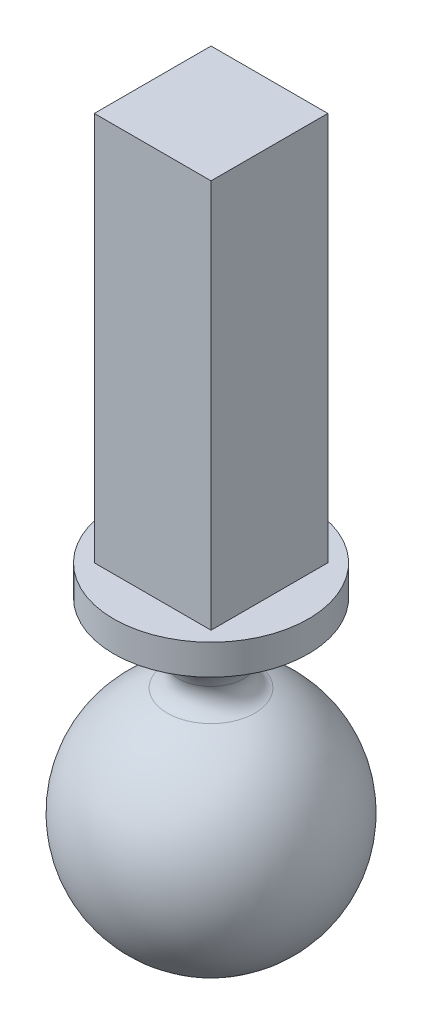
ISO-10303-21;
HEADER;
FILE_DESCRIPTION(('STEP AP214'),'2;1');
FILE_NAME('part.step','',(''),(''),'','','');
FILE_SCHEMA(('AUTOMOTIVE_DESIGN { 1 0 10303 214 1 1 1 1 }'));
ENDSEC;
DATA;
#1=APPLICATION_CONTEXT('core data for automotive mechanical design processes');
#2=APPLICATION_PROTOCOL_DEFINITION('international standard','automotive_design',2000,#1);
#3=PRODUCT_CONTEXT('',#1,'mechanical');
#4=PRODUCT('Part','Part','',(#3));
#5=PRODUCT_RELATED_PRODUCT_CATEGORY('part','',(#4));
#6=PRODUCT_DEFINITION_FORMATION('','',#4);
#7=PRODUCT_DEFINITION_CONTEXT('part definition',#1,'design');
#8=PRODUCT_DEFINITION('design','',#6,#7);
#9=PRODUCT_DEFINITION_SHAPE('','',#8);
#10=(LENGTH_UNIT() NAMED_UNIT(*) SI_UNIT(.MILLI.,.METRE.));
#11=(NAMED_UNIT(*) PLANE_ANGLE_UNIT() SI_UNIT($,.RADIAN.));
#12=(NAMED_UNIT(*) SI_UNIT($,.STERADIAN.) SOLID_ANGLE_UNIT());
#13=UNCERTAINTY_MEASURE_WITH_UNIT(LENGTH_MEASURE(1.E-05),#10,'distance_accuracy_value','');
#14=(GEOMETRIC_REPRESENTATION_CONTEXT(3) GLOBAL_UNCERTAINTY_ASSIGNED_CONTEXT((#13)) GLOBAL_UNIT_ASSIGNED_CONTEXT((#10,
#11,#12)) REPRESENTATION_CONTEXT('',''));
#15=CARTESIAN_POINT('',(0.,0.,0.));
#16=DIRECTION('',(0.,0.,1.));
#17=DIRECTION('',(1.,0.,0.));
#18=AXIS2_PLACEMENT_3D('',#15,#16,#17);
#19=CARTESIAN_POINT('',(-3.69404705938733,11.1288388993847,0.));
#20=DIRECTION('',(0.,1.,0.));
#21=DIRECTION('',(0.,0.,1.));
#22=AXIS2_PLACEMENT_3D('',#19,#20,#21);
#23=PLANE('',#22);
#24=CARTESIAN_POINT('',(0.,11.1288388993847,0.));
#25=DIRECTION('',(0.,1.,0.));
#26=DIRECTION('',(0.,0.,1.));
#27=AXIS2_PLACEMENT_3D('',#24,#25,#26);
#28=CIRCLE('',#27,5.);
#29=CARTESIAN_POINT('',(0.,11.1288388993847,5.));
#30=VERTEX_POINT('',#29);
#31=EDGE_CURVE('E112',#30,#30,#28,.T.);
#32=ORIENTED_EDGE('',*,*,#31,.T.);
#33=EDGE_LOOP('',(#32));
#34=FACE_BOUND('',#33,.T.);
#35=DIRECTION('',(-1.,0.,0.));
#36=VECTOR('',#35,1.);
#37=CARTESIAN_POINT('',(-3.,11.1288388993847,-3.));
#38=LINE('',#37,#36);
#39=CARTESIAN_POINT('',(3.,11.1288388993847,-3.));
#40=VERTEX_POINT('',#39);
#41=CARTESIAN_POINT('',(-3.,11.1288388993847,-3.));
#42=VERTEX_POINT('',#41);
#43=EDGE_CURVE('E91',#40,#42,#38,.T.);
#44=ORIENTED_EDGE('',*,*,#43,.F.);
#45=DIRECTION('',(0.,0.,-1.));
#46=VECTOR('',#45,1.);
#47=CARTESIAN_POINT('',(3.,11.1288388993847,-3.));
#48=LINE('',#47,#46);
#49=CARTESIAN_POINT('',(3.,11.1288388993847,3.));
#50=VERTEX_POINT('',#49);
#51=EDGE_CURVE('E102',#50,#40,#48,.T.);
#52=ORIENTED_EDGE('',*,*,#51,.F.);
#53=DIRECTION('',(1.,0.,0.));
#54=VECTOR('',#53,1.);
#55=CARTESIAN_POINT('',(-3.,11.1288388993847,3.));
#56=LINE('',#55,#54);
#57=CARTESIAN_POINT('',(-3.,11.1288388993847,3.));
#58=VERTEX_POINT('',#57);
#59=EDGE_CURVE('E72',#58,#50,#56,.T.);
#60=ORIENTED_EDGE('',*,*,#59,.F.);
#61=DIRECTION('',(0.,0.,1.));
#62=VECTOR('',#61,1.);
#63=CARTESIAN_POINT('',(-3.,11.1288388993847,-3.));
#64=LINE('',#63,#62);
#65=EDGE_CURVE('E106',#42,#58,#64,.T.);
#66=ORIENTED_EDGE('',*,*,#65,.F.);
#67=EDGE_LOOP('',(#44,#52,#60,#66));
#68=FACE_BOUND('',#67,.T.);
#69=ADVANCED_FACE('F35',(#34,#68),#23,.T.);
#70=CARTESIAN_POINT('',(0.,0.,0.));
#71=DIRECTION('',(0.,1.,0.));
#72=DIRECTION('',(-1.,0.,0.));
#73=AXIS2_PLACEMENT_3D('',#70,#71,#72);
#74=SPHERICAL_SURFACE('',#73,6.);
#75=CARTESIAN_POINT('',(0.,5.56216801963144,0.));
#76=DIRECTION('',(0.,1.,0.));
#77=DIRECTION('',(0.,0.,1.));
#78=AXIS2_PLACEMENT_3D('',#75,#76,#77);
#79=CIRCLE('',#78,2.24995264869936);
#80=CARTESIAN_POINT('',(0.,5.56216801963144,2.24995264869936));
#81=VERTEX_POINT('',#80);
#82=EDGE_CURVE('E11',#81,#81,#79,.T.);
#83=ORIENTED_EDGE('',*,*,#82,.F.);
#84=EDGE_LOOP('',(#83));
#85=FACE_BOUND('',#84,.T.);
#86=ADVANCED_FACE('F37',(#85),#74,.T.);
#87=CARTESIAN_POINT('',(0.,6.48919602290335,0.));
#88=DIRECTION('',(0.,1.,0.));
#89=DIRECTION('',(0.,0.,1.));
#90=AXIS2_PLACEMENT_3D('',#87,#88,#89);
#91=TOROIDAL_SURFACE('',#90,2.62494475681592,1.);
#92=ORIENTED_EDGE('',*,*,#82,.T.);
#93=EDGE_LOOP('',(#92));
#94=FACE_BOUND('',#93,.T.);
#95=CARTESIAN_POINT('',(0.,6.81383167794624,0.));
#96=DIRECTION('',(0.,1.,0.));
#97=DIRECTION('',(0.,0.,1.));
#98=AXIS2_PLACEMENT_3D('',#95,#96,#97);
#99=CIRCLE('',#98,1.67910561009229);
#100=CARTESIAN_POINT('',(0.,6.81383167794624,1.67910561009229));
#101=VERTEX_POINT('',#100);
#102=EDGE_CURVE('E43',#101,#101,#99,.T.);
#103=ORIENTED_EDGE('',*,*,#102,.F.);
#104=EDGE_LOOP('',(#103));
#105=FACE_BOUND('',#104,.T.);
#106=ADVANCED_FACE('F126',(#94,#105),#91,.F.);
#107=CARTESIAN_POINT('',(-5.,9.57280986376108,0.));
#108=CARTESIAN_POINT('',(-2.25540699268525,8.49290912831238,0.));
#109=CARTESIAN_POINT('',(-1.67910561009229,6.81383167794624,0.));
#110=B_SPLINE_CURVE_WITH_KNOTS('',2,(#107,#108,#109),.UNSPECIFIED.,.F.,.F.,(3,3),(0.,1.),.UNSPECIFIED.);
#111=CARTESIAN_POINT('',(0.,11.8823529411765,0.));
#112=DIRECTION('',(0.,1.,0.));
#113=AXIS1_PLACEMENT('',#111,#112);
#114=SURFACE_OF_REVOLUTION('',#110,#113);
#115=ORIENTED_EDGE('',*,*,#102,.T.);
#116=EDGE_LOOP('',(#115));
#117=FACE_BOUND('',#116,.T.);
#118=CARTESIAN_POINT('',(0.,9.57280986376108,0.));
#119=DIRECTION('',(0.,1.,0.));
#120=DIRECTION('',(0.,0.,1.));
#121=AXIS2_PLACEMENT_3D('',#118,#119,#120);
#122=CIRCLE('',#121,5.);
#123=CARTESIAN_POINT('',(0.,9.57280986376108,5.));
#124=VERTEX_POINT('',#123);
#125=EDGE_CURVE('E219',#124,#124,#122,.T.);
#126=ORIENTED_EDGE('',*,*,#125,.F.);
#127=EDGE_LOOP('',(#126));
#128=FACE_BOUND('',#127,.T.);
#129=ADVANCED_FACE('F122',(#117,#128),#114,.F.);
#130=CARTESIAN_POINT('',(0.,11.8823529411765,0.));
#131=DIRECTION('',(0.,1.,0.));
#132=DIRECTION('',(0.,0.,1.));
#133=AXIS2_PLACEMENT_3D('',#130,#131,#132);
#134=CYLINDRICAL_SURFACE('',#133,5.);
#135=ORIENTED_EDGE('',*,*,#125,.T.);
#136=EDGE_LOOP('',(#135));
#137=FACE_BOUND('',#136,.T.);
#138=ORIENTED_EDGE('',*,*,#31,.F.);
#139=EDGE_LOOP('',(#138));
#140=FACE_BOUND('',#139,.T.);
#141=ADVANCED_FACE('F125',(#137,#140),#134,.T.);
#142=CARTESIAN_POINT('',(3.,31.1288388993847,-3.));
#143=DIRECTION('',(-1.,0.,0.));
#144=DIRECTION('',(0.,0.,1.));
#145=AXIS2_PLACEMENT_3D('',#142,#143,#144);
#146=PLANE('',#145);
#147=ORIENTED_EDGE('',*,*,#51,.T.);
#148=DIRECTION('',(0.,-1.,0.));
#149=VECTOR('',#148,1.);
#150=CARTESIAN_POINT('',(3.,31.1288388993847,-3.));
#151=LINE('',#150,#149);
#152=CARTESIAN_POINT('',(3.,31.1288388993847,-3.));
#153=VERTEX_POINT('',#152);
#154=EDGE_CURVE('E94',#153,#40,#151,.T.);
#155=ORIENTED_EDGE('',*,*,#154,.F.);
#156=DIRECTION('',(0.,0.,-1.));
#157=VECTOR('',#156,1.);
#158=CARTESIAN_POINT('',(3.,31.1288388993847,-3.));
#159=LINE('',#158,#157);
#160=CARTESIAN_POINT('',(3.,31.1288388993847,3.));
#161=VERTEX_POINT('',#160);
#162=EDGE_CURVE('E84',#161,#153,#159,.T.);
#163=ORIENTED_EDGE('',*,*,#162,.F.);
#164=DIRECTION('',(0.,-1.,0.));
#165=VECTOR('',#164,1.);
#166=CARTESIAN_POINT('',(3.,31.1288388993847,3.));
#167=LINE('',#166,#165);
#168=EDGE_CURVE('E98',#161,#50,#167,.T.);
#169=ORIENTED_EDGE('',*,*,#168,.T.);
#170=EDGE_LOOP('',(#147,#155,#163,#169));
#171=FACE_BOUND('',#170,.T.);
#172=ADVANCED_FACE('F143',(#171),#146,.F.);
#173=CARTESIAN_POINT('',(-3.,31.1288388993847,-3.));
#174=DIRECTION('',(0.,0.,1.));
#175=DIRECTION('',(1.,0.,0.));
#176=AXIS2_PLACEMENT_3D('',#173,#174,#175);
#177=PLANE('',#176);
#178=ORIENTED_EDGE('',*,*,#43,.T.);
#179=DIRECTION('',(0.,-1.,0.));
#180=VECTOR('',#179,1.);
#181=CARTESIAN_POINT('',(-3.,31.1288388993847,-3.));
#182=LINE('',#181,#180);
#183=CARTESIAN_POINT('',(-3.,31.1288388993847,-3.));
#184=VERTEX_POINT('',#183);
#185=EDGE_CURVE('E88',#184,#42,#182,.T.);
#186=ORIENTED_EDGE('',*,*,#185,.F.);
#187=DIRECTION('',(-1.,0.,0.));
#188=VECTOR('',#187,1.);
#189=CARTESIAN_POINT('',(-3.,31.1288388993847,-3.));
#190=LINE('',#189,#188);
#191=EDGE_CURVE('E79',#153,#184,#190,.T.);
#192=ORIENTED_EDGE('',*,*,#191,.F.);
#193=ORIENTED_EDGE('',*,*,#154,.T.);
#194=EDGE_LOOP('',(#178,#186,#192,#193));
#195=FACE_BOUND('',#194,.T.);
#196=ADVANCED_FACE('F89',(#195),#177,.F.);
#197=CARTESIAN_POINT('',(-3.,31.1288388993847,-3.));
#198=DIRECTION('',(1.,0.,0.));
#199=DIRECTION('',(0.,0.,-1.));
#200=AXIS2_PLACEMENT_3D('',#197,#198,#199);
#201=PLANE('',#200);
#202=ORIENTED_EDGE('',*,*,#65,.T.);
#203=DIRECTION('',(0.,-1.,0.));
#204=VECTOR('',#203,1.);
#205=CARTESIAN_POINT('',(-3.,31.1288388993847,3.));
#206=LINE('',#205,#204);
#207=CARTESIAN_POINT('',(-3.,31.1288388993847,3.));
#208=VERTEX_POINT('',#207);
#209=EDGE_CURVE('E50',#208,#58,#206,.T.);
#210=ORIENTED_EDGE('',*,*,#209,.F.);
#211=DIRECTION('',(0.,0.,1.));
#212=VECTOR('',#211,1.);
#213=CARTESIAN_POINT('',(-3.,31.1288388993847,-3.));
#214=LINE('',#213,#212);
#215=EDGE_CURVE('E82',#184,#208,#214,.T.);
#216=ORIENTED_EDGE('',*,*,#215,.F.);
#217=ORIENTED_EDGE('',*,*,#185,.T.);
#218=EDGE_LOOP('',(#202,#210,#216,#217));
#219=FACE_BOUND('',#218,.T.);
#220=ADVANCED_FACE('F96',(#219),#201,.F.);
#221=CARTESIAN_POINT('',(-3.,31.1288388993847,3.));
#222=DIRECTION('',(0.,0.,-1.));
#223=DIRECTION('',(-1.,0.,0.));
#224=AXIS2_PLACEMENT_3D('',#221,#222,#223);
#225=PLANE('',#224);
#226=ORIENTED_EDGE('',*,*,#59,.T.);
#227=ORIENTED_EDGE('',*,*,#168,.F.);
#228=DIRECTION('',(1.,0.,0.));
#229=VECTOR('',#228,1.);
#230=CARTESIAN_POINT('',(-3.,31.1288388993847,3.));
#231=LINE('',#230,#229);
#232=EDGE_CURVE('E58',#208,#161,#231,.T.);
#233=ORIENTED_EDGE('',*,*,#232,.F.);
#234=ORIENTED_EDGE('',*,*,#209,.T.);
#235=EDGE_LOOP('',(#226,#227,#233,#234));
#236=FACE_BOUND('',#235,.T.);
#237=ADVANCED_FACE('F151',(#236),#225,.F.);
#238=CARTESIAN_POINT('',(0.,31.1288388993847,0.));
#239=DIRECTION('',(0.,1.,0.));
#240=DIRECTION('',(0.,0.,1.));
#241=AXIS2_PLACEMENT_3D('',#238,#239,#240);
#242=PLANE('',#241);
#243=ORIENTED_EDGE('',*,*,#162,.T.);
#244=ORIENTED_EDGE('',*,*,#191,.T.);
#245=ORIENTED_EDGE('',*,*,#215,.T.);
#246=ORIENTED_EDGE('',*,*,#232,.T.);
#247=EDGE_LOOP('',(#243,#244,#245,#246));
#248=FACE_BOUND('',#247,.T.);
#249=ADVANCED_FACE('F80',(#248),#242,.T.);
#250=CLOSED_SHELL('',(#69,#86,#106,#129,#141,#172,#196,#220,#237,#249));
#251=MANIFOLD_SOLID_BREP('B2',#250);
#252=ADVANCED_BREP_SHAPE_REPRESENTATION('',(#18,#251),#14);
#253=SHAPE_DEFINITION_REPRESENTATION(#9,#252);
ENDSEC;
END-ISO-10303-21;
